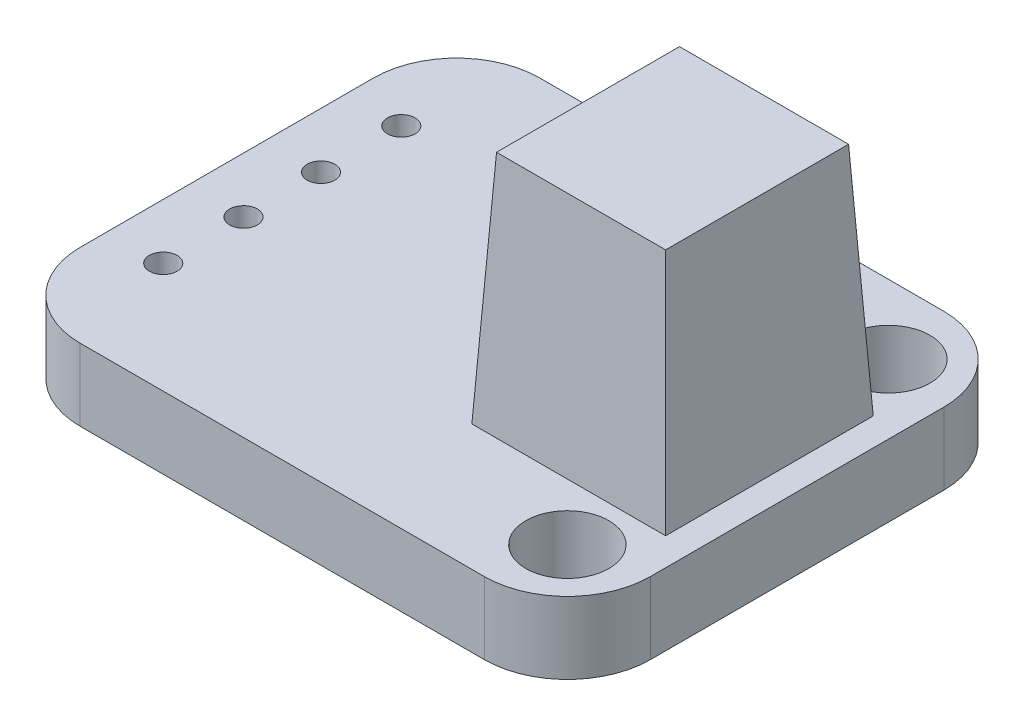
ISO-10303-21;
HEADER;
FILE_DESCRIPTION(('STEP AP214'),'2;1');
FILE_NAME('part.step','',(''),(''),'','','');
FILE_SCHEMA(('AUTOMOTIVE_DESIGN { 1 0 10303 214 1 1 1 1 }'));
ENDSEC;
DATA;
#1=APPLICATION_CONTEXT('core data for automotive mechanical design processes');
#2=APPLICATION_PROTOCOL_DEFINITION('international standard','automotive_design',2000,#1);
#3=PRODUCT_CONTEXT('',#1,'mechanical');
#4=PRODUCT('Part','Part','',(#3));
#5=PRODUCT_RELATED_PRODUCT_CATEGORY('part','',(#4));
#6=PRODUCT_DEFINITION_FORMATION('','',#4);
#7=PRODUCT_DEFINITION_CONTEXT('part definition',#1,'design');
#8=PRODUCT_DEFINITION('design','',#6,#7);
#9=PRODUCT_DEFINITION_SHAPE('','',#8);
#10=(LENGTH_UNIT() NAMED_UNIT(*) SI_UNIT(.MILLI.,.METRE.));
#11=(NAMED_UNIT(*) PLANE_ANGLE_UNIT() SI_UNIT($,.RADIAN.));
#12=(NAMED_UNIT(*) SI_UNIT($,.STERADIAN.) SOLID_ANGLE_UNIT());
#13=UNCERTAINTY_MEASURE_WITH_UNIT(LENGTH_MEASURE(1.E-05),#10,'distance_accuracy_value','');
#14=(GEOMETRIC_REPRESENTATION_CONTEXT(3) GLOBAL_UNCERTAINTY_ASSIGNED_CONTEXT((#13)) GLOBAL_UNIT_ASSIGNED_CONTEXT((#10,
#11,#12)) REPRESENTATION_CONTEXT('',''));
#15=CARTESIAN_POINT('',(0.,0.,0.));
#16=DIRECTION('',(0.,0.,1.));
#17=DIRECTION('',(1.,0.,0.));
#18=AXIS2_PLACEMENT_3D('',#15,#16,#17);
#19=CARTESIAN_POINT('',(0.,2.6,0.));
#20=DIRECTION('',(0.,-1.,0.));
#21=DIRECTION('',(0.,0.,-1.));
#22=AXIS2_PLACEMENT_3D('',#19,#20,#21);
#23=PLANE('',#22);
#24=CARTESIAN_POINT('',(-8.3,2.6,-4.3));
#25=DIRECTION('',(0.,1.,0.));
#26=DIRECTION('',(0.,0.,1.));
#27=AXIS2_PLACEMENT_3D('',#24,#25,#26);
#28=CIRCLE('',#27,0.500000000000001);
#29=CARTESIAN_POINT('',(-8.3,2.6,-3.8));
#30=VERTEX_POINT('',#29);
#31=EDGE_CURVE('E237',#30,#30,#28,.T.);
#32=ORIENTED_EDGE('',*,*,#31,.F.);
#33=EDGE_LOOP('',(#32));
#34=FACE_BOUND('',#33,.T.);
#35=CARTESIAN_POINT('',(-8.3,2.6,1.4));
#36=DIRECTION('',(0.,1.,0.));
#37=DIRECTION('',(0.,0.,1.));
#38=AXIS2_PLACEMENT_3D('',#35,#36,#37);
#39=CIRCLE('',#38,0.500000000000001);
#40=CARTESIAN_POINT('',(-8.3,2.6,1.9));
#41=VERTEX_POINT('',#40);
#42=EDGE_CURVE('E526',#41,#41,#39,.T.);
#43=ORIENTED_EDGE('',*,*,#42,.F.);
#44=EDGE_LOOP('',(#43));
#45=FACE_BOUND('',#44,.T.);
#46=CARTESIAN_POINT('',(-8.3,2.6,-1.4));
#47=DIRECTION('',(0.,1.,0.));
#48=DIRECTION('',(0.,0.,1.));
#49=AXIS2_PLACEMENT_3D('',#46,#47,#48);
#50=CIRCLE('',#49,0.500000000000001);
#51=CARTESIAN_POINT('',(-8.3,2.6,-0.9));
#52=VERTEX_POINT('',#51);
#53=EDGE_CURVE('E527',#52,#52,#50,.T.);
#54=ORIENTED_EDGE('',*,*,#53,.F.);
#55=EDGE_LOOP('',(#54));
#56=FACE_BOUND('',#55,.T.);
#57=CARTESIAN_POINT('',(-8.3,2.6,4.3));
#58=DIRECTION('',(0.,1.,0.));
#59=DIRECTION('',(0.,0.,1.));
#60=AXIS2_PLACEMENT_3D('',#57,#58,#59);
#61=CIRCLE('',#60,0.500000000000001);
#62=CARTESIAN_POINT('',(-8.3,2.6,4.8));
#63=VERTEX_POINT('',#62);
#64=EDGE_CURVE('E532',#63,#63,#61,.T.);
#65=ORIENTED_EDGE('',*,*,#64,.F.);
#66=EDGE_LOOP('',(#65));
#67=FACE_BOUND('',#66,.T.);
#68=DIRECTION('',(-1.,0.,0.));
#69=VECTOR('',#68,1.);
#70=CARTESIAN_POINT('',(-10.3,2.6,-8.3));
#71=LINE('',#70,#69);
#72=CARTESIAN_POINT('',(7.29999999999999,2.6,-8.3));
#73=VERTEX_POINT('',#72);
#74=CARTESIAN_POINT('',(-7.3,2.6,-8.3));
#75=VERTEX_POINT('',#74);
#76=EDGE_CURVE('E180',#73,#75,#71,.T.);
#77=ORIENTED_EDGE('',*,*,#76,.T.);
#78=CARTESIAN_POINT('',(-7.3,2.6,-5.3));
#79=DIRECTION('',(0.,-1.,0.));
#80=DIRECTION('',(0.,0.,-1.));
#81=AXIS2_PLACEMENT_3D('',#78,#79,#80);
#82=CIRCLE('',#81,3.);
#83=CARTESIAN_POINT('',(-10.3,2.6,-5.3));
#84=VERTEX_POINT('',#83);
#85=EDGE_CURVE('E224',#75,#84,#82,.F.);
#86=ORIENTED_EDGE('',*,*,#85,.T.);
#87=DIRECTION('',(0.,0.,1.));
#88=VECTOR('',#87,1.);
#89=CARTESIAN_POINT('',(-10.3,2.6,8.3));
#90=LINE('',#89,#88);
#91=CARTESIAN_POINT('',(-10.3,2.6,5.3));
#92=VERTEX_POINT('',#91);
#93=EDGE_CURVE('E184',#84,#92,#90,.T.);
#94=ORIENTED_EDGE('',*,*,#93,.T.);
#95=CARTESIAN_POINT('',(-7.3,2.6,5.3));
#96=DIRECTION('',(0.,-1.,0.));
#97=DIRECTION('',(0.,0.,-1.));
#98=AXIS2_PLACEMENT_3D('',#95,#96,#97);
#99=CIRCLE('',#98,3.);
#100=CARTESIAN_POINT('',(-7.3,2.6,8.3));
#101=VERTEX_POINT('',#100);
#102=EDGE_CURVE('E222',#92,#101,#99,.F.);
#103=ORIENTED_EDGE('',*,*,#102,.T.);
#104=DIRECTION('',(1.,0.,0.));
#105=VECTOR('',#104,1.);
#106=CARTESIAN_POINT('',(-10.3,2.6,8.3));
#107=LINE('',#106,#105);
#108=CARTESIAN_POINT('',(7.29999999999999,2.6,8.3));
#109=VERTEX_POINT('',#108);
#110=EDGE_CURVE('E187',#101,#109,#107,.T.);
#111=ORIENTED_EDGE('',*,*,#110,.T.);
#112=CARTESIAN_POINT('',(7.3,2.6,5.3));
#113=DIRECTION('',(0.,-1.,0.));
#114=DIRECTION('',(0.,0.,-1.));
#115=AXIS2_PLACEMENT_3D('',#112,#113,#114);
#116=CIRCLE('',#115,3.);
#117=CARTESIAN_POINT('',(10.3,2.6,5.3));
#118=VERTEX_POINT('',#117);
#119=EDGE_CURVE('E218',#109,#118,#116,.F.);
#120=ORIENTED_EDGE('',*,*,#119,.T.);
#121=DIRECTION('',(0.,0.,-1.));
#122=VECTOR('',#121,1.);
#123=CARTESIAN_POINT('',(10.3,2.6,8.3));
#124=LINE('',#123,#122);
#125=CARTESIAN_POINT('',(10.3,2.6,-5.3));
#126=VERTEX_POINT('',#125);
#127=EDGE_CURVE('E177',#118,#126,#124,.T.);
#128=ORIENTED_EDGE('',*,*,#127,.T.);
#129=CARTESIAN_POINT('',(7.3,2.6,-5.3));
#130=DIRECTION('',(0.,-1.,0.));
#131=DIRECTION('',(0.,0.,-1.));
#132=AXIS2_PLACEMENT_3D('',#129,#130,#131);
#133=CIRCLE('',#132,3.);
#134=EDGE_CURVE('E220',#126,#73,#133,.F.);
#135=ORIENTED_EDGE('',*,*,#134,.T.);
#136=EDGE_LOOP('',(#77,#86,#94,#103,#111,#120,#128,#135));
#137=FACE_BOUND('',#136,.T.);
#138=CARTESIAN_POINT('',(7.8,2.6,5.8));
#139=DIRECTION('',(0.,1.,0.));
#140=DIRECTION('',(0.,0.,1.));
#141=AXIS2_PLACEMENT_3D('',#138,#139,#140);
#142=CIRCLE('',#141,1.5);
#143=CARTESIAN_POINT('',(7.8,2.6,7.3));
#144=VERTEX_POINT('',#143);
#145=EDGE_CURVE('E174',#144,#144,#142,.T.);
#146=ORIENTED_EDGE('',*,*,#145,.F.);
#147=EDGE_LOOP('',(#146));
#148=FACE_BOUND('',#147,.T.);
#149=CARTESIAN_POINT('',(7.8,2.6,-5.8));
#150=DIRECTION('',(0.,1.,0.));
#151=DIRECTION('',(0.,0.,1.));
#152=AXIS2_PLACEMENT_3D('',#149,#150,#151);
#153=CIRCLE('',#152,1.5);
#154=CARTESIAN_POINT('',(7.8,2.6,-4.3));
#155=VERTEX_POINT('',#154);
#156=EDGE_CURVE('E168',#155,#155,#153,.T.);
#157=ORIENTED_EDGE('',*,*,#156,.F.);
#158=EDGE_LOOP('',(#157));
#159=FACE_BOUND('',#158,.T.);
#160=DIRECTION('',(0.,0.,-1.));
#161=VECTOR('',#160,1.);
#162=CARTESIAN_POINT('',(9.3,2.6,-3.75));
#163=LINE('',#162,#161);
#164=CARTESIAN_POINT('',(9.3,2.6,3.75));
#165=VERTEX_POINT('',#164);
#166=CARTESIAN_POINT('',(9.3,2.6,-3.75));
#167=VERTEX_POINT('',#166);
#168=EDGE_CURVE('E129',#165,#167,#163,.T.);
#169=ORIENTED_EDGE('',*,*,#168,.F.);
#170=DIRECTION('',(1.,0.,0.));
#171=VECTOR('',#170,1.);
#172=CARTESIAN_POINT('',(2.3,2.6,3.75));
#173=LINE('',#172,#171);
#174=CARTESIAN_POINT('',(2.3,2.6,3.75));
#175=VERTEX_POINT('',#174);
#176=EDGE_CURVE('E131',#175,#165,#173,.T.);
#177=ORIENTED_EDGE('',*,*,#176,.F.);
#178=DIRECTION('',(0.,0.,1.));
#179=VECTOR('',#178,1.);
#180=CARTESIAN_POINT('',(2.3,2.6,-3.75));
#181=LINE('',#180,#179);
#182=CARTESIAN_POINT('',(2.3,2.6,-3.75));
#183=VERTEX_POINT('',#182);
#184=EDGE_CURVE('E65',#183,#175,#181,.T.);
#185=ORIENTED_EDGE('',*,*,#184,.F.);
#186=DIRECTION('',(-1.,0.,0.));
#187=VECTOR('',#186,1.);
#188=CARTESIAN_POINT('',(2.3,2.6,-3.75));
#189=LINE('',#188,#187);
#190=EDGE_CURVE('E60',#167,#183,#189,.T.);
#191=ORIENTED_EDGE('',*,*,#190,.F.);
#192=EDGE_LOOP('',(#169,#177,#185,#191));
#193=FACE_BOUND('',#192,.T.);
#194=ADVANCED_FACE('F43',(#34,#45,#56,#67,#137,#148,#159,#193),#23,.F.);
#195=CARTESIAN_POINT('',(10.3,2.6,8.3));
#196=DIRECTION('',(-1.,0.,0.));
#197=DIRECTION('',(0.,0.,1.));
#198=AXIS2_PLACEMENT_3D('',#195,#196,#197);
#199=PLANE('',#198);
#200=DIRECTION('',(0.,0.,-1.));
#201=VECTOR('',#200,1.);
#202=CARTESIAN_POINT('',(10.3,0.,8.3));
#203=LINE('',#202,#201);
#204=CARTESIAN_POINT('',(10.3,0.,5.3));
#205=VERTEX_POINT('',#204);
#206=CARTESIAN_POINT('',(10.3,0.,-5.3));
#207=VERTEX_POINT('',#206);
#208=EDGE_CURVE('E167',#205,#207,#203,.T.);
#209=ORIENTED_EDGE('',*,*,#208,.T.);
#210=DIRECTION('',(0.,-1.,0.));
#211=VECTOR('',#210,1.);
#212=CARTESIAN_POINT('',(10.3,2.6,-5.3));
#213=LINE('',#212,#211);
#214=EDGE_CURVE('E11',#207,#126,#213,.F.);
#215=ORIENTED_EDGE('',*,*,#214,.T.);
#216=ORIENTED_EDGE('',*,*,#127,.F.);
#217=DIRECTION('',(0.,-1.,0.));
#218=VECTOR('',#217,1.);
#219=CARTESIAN_POINT('',(10.3,2.6,5.3));
#220=LINE('',#219,#218);
#221=EDGE_CURVE('E52',#118,#205,#220,.T.);
#222=ORIENTED_EDGE('',*,*,#221,.T.);
#223=EDGE_LOOP('',(#209,#215,#216,#222));
#224=FACE_BOUND('',#223,.T.);
#225=ADVANCED_FACE('F287',(#224),#199,.F.);
#226=CARTESIAN_POINT('',(-10.3,2.6,-8.3));
#227=DIRECTION('',(0.,0.,1.));
#228=DIRECTION('',(1.,0.,0.));
#229=AXIS2_PLACEMENT_3D('',#226,#227,#228);
#230=PLANE('',#229);
#231=DIRECTION('',(-1.,0.,0.));
#232=VECTOR('',#231,1.);
#233=CARTESIAN_POINT('',(-10.3,0.,-8.3));
#234=LINE('',#233,#232);
#235=CARTESIAN_POINT('',(7.29999999999999,0.,-8.3));
#236=VERTEX_POINT('',#235);
#237=CARTESIAN_POINT('',(-7.3,0.,-8.3));
#238=VERTEX_POINT('',#237);
#239=EDGE_CURVE('E193',#236,#238,#234,.T.);
#240=ORIENTED_EDGE('',*,*,#239,.T.);
#241=DIRECTION('',(0.,-1.,0.));
#242=VECTOR('',#241,1.);
#243=CARTESIAN_POINT('',(-7.3,2.6,-8.3));
#244=LINE('',#243,#242);
#245=EDGE_CURVE('E216',#238,#75,#244,.F.);
#246=ORIENTED_EDGE('',*,*,#245,.T.);
#247=ORIENTED_EDGE('',*,*,#76,.F.);
#248=DIRECTION('',(0.,-1.,0.));
#249=VECTOR('',#248,1.);
#250=CARTESIAN_POINT('',(7.3,2.6,-8.3));
#251=LINE('',#250,#249);
#252=EDGE_CURVE('E213',#73,#236,#251,.T.);
#253=ORIENTED_EDGE('',*,*,#252,.T.);
#254=EDGE_LOOP('',(#240,#246,#247,#253));
#255=FACE_BOUND('',#254,.T.);
#256=ADVANCED_FACE('F296',(#255),#230,.F.);
#257=CARTESIAN_POINT('',(-10.3,2.6,8.3));
#258=DIRECTION('',(1.,0.,0.));
#259=DIRECTION('',(0.,0.,-1.));
#260=AXIS2_PLACEMENT_3D('',#257,#258,#259);
#261=PLANE('',#260);
#262=ORIENTED_EDGE('',*,*,#93,.F.);
#263=DIRECTION('',(0.,-1.,0.));
#264=VECTOR('',#263,1.);
#265=CARTESIAN_POINT('',(-10.3,2.6,-5.3));
#266=LINE('',#265,#264);
#267=CARTESIAN_POINT('',(-10.3,0.,-5.3));
#268=VERTEX_POINT('',#267);
#269=EDGE_CURVE('E202',#84,#268,#266,.T.);
#270=ORIENTED_EDGE('',*,*,#269,.T.);
#271=DIRECTION('',(0.,0.,1.));
#272=VECTOR('',#271,1.);
#273=CARTESIAN_POINT('',(-10.3,0.,8.3));
#274=LINE('',#273,#272);
#275=CARTESIAN_POINT('',(-10.3,0.,5.3));
#276=VERTEX_POINT('',#275);
#277=EDGE_CURVE('E196',#268,#276,#274,.T.);
#278=ORIENTED_EDGE('',*,*,#277,.T.);
#279=DIRECTION('',(0.,-1.,0.));
#280=VECTOR('',#279,1.);
#281=CARTESIAN_POINT('',(-10.3,2.6,5.3));
#282=LINE('',#281,#280);
#283=EDGE_CURVE('E190',#276,#92,#282,.F.);
#284=ORIENTED_EDGE('',*,*,#283,.T.);
#285=EDGE_LOOP('',(#262,#270,#278,#284));
#286=FACE_BOUND('',#285,.T.);
#287=ADVANCED_FACE('F270',(#286),#261,.F.);
#288=CARTESIAN_POINT('',(-10.3,2.6,8.3));
#289=DIRECTION('',(0.,0.,-1.));
#290=DIRECTION('',(-1.,0.,0.));
#291=AXIS2_PLACEMENT_3D('',#288,#289,#290);
#292=PLANE('',#291);
#293=ORIENTED_EDGE('',*,*,#110,.F.);
#294=DIRECTION('',(0.,-1.,0.));
#295=VECTOR('',#294,1.);
#296=CARTESIAN_POINT('',(-7.3,2.6,8.3));
#297=LINE('',#296,#295);
#298=CARTESIAN_POINT('',(-7.3,0.,8.3));
#299=VERTEX_POINT('',#298);
#300=EDGE_CURVE('E228',#101,#299,#297,.T.);
#301=ORIENTED_EDGE('',*,*,#300,.T.);
#302=DIRECTION('',(1.,0.,0.));
#303=VECTOR('',#302,1.);
#304=CARTESIAN_POINT('',(-10.3,0.,8.3));
#305=LINE('',#304,#303);
#306=CARTESIAN_POINT('',(7.29999999999999,0.,8.3));
#307=VERTEX_POINT('',#306);
#308=EDGE_CURVE('E181',#299,#307,#305,.T.);
#309=ORIENTED_EDGE('',*,*,#308,.T.);
#310=DIRECTION('',(0.,-1.,0.));
#311=VECTOR('',#310,1.);
#312=CARTESIAN_POINT('',(7.3,2.6,8.3));
#313=LINE('',#312,#311);
#314=EDGE_CURVE('E226',#307,#109,#313,.F.);
#315=ORIENTED_EDGE('',*,*,#314,.T.);
#316=EDGE_LOOP('',(#293,#301,#309,#315));
#317=FACE_BOUND('',#316,.T.);
#318=ADVANCED_FACE('F253',(#317),#292,.F.);
#319=CARTESIAN_POINT('',(0.,0.,0.));
#320=DIRECTION('',(0.,-1.,0.));
#321=DIRECTION('',(0.,0.,-1.));
#322=AXIS2_PLACEMENT_3D('',#319,#320,#321);
#323=PLANE('',#322);
#324=CARTESIAN_POINT('',(-8.3,0.,-4.3));
#325=DIRECTION('',(0.,-1.,0.));
#326=DIRECTION('',(0.,0.,-1.));
#327=AXIS2_PLACEMENT_3D('',#324,#325,#326);
#328=CIRCLE('',#327,0.500000000000001);
#329=CARTESIAN_POINT('',(-8.3,0.,-4.8));
#330=VERTEX_POINT('',#329);
#331=EDGE_CURVE('E47',#330,#330,#328,.T.);
#332=ORIENTED_EDGE('',*,*,#331,.F.);
#333=EDGE_LOOP('',(#332));
#334=FACE_BOUND('',#333,.T.);
#335=CARTESIAN_POINT('',(-8.3,0.,1.4));
#336=DIRECTION('',(0.,-1.,0.));
#337=DIRECTION('',(0.,0.,-1.));
#338=AXIS2_PLACEMENT_3D('',#335,#336,#337);
#339=CIRCLE('',#338,0.500000000000001);
#340=CARTESIAN_POINT('',(-8.3,0.,0.899999999999999));
#341=VERTEX_POINT('',#340);
#342=EDGE_CURVE('E239',#341,#341,#339,.T.);
#343=ORIENTED_EDGE('',*,*,#342,.F.);
#344=EDGE_LOOP('',(#343));
#345=FACE_BOUND('',#344,.T.);
#346=CARTESIAN_POINT('',(-8.3,0.,-1.4));
#347=DIRECTION('',(0.,-1.,0.));
#348=DIRECTION('',(0.,0.,-1.));
#349=AXIS2_PLACEMENT_3D('',#346,#347,#348);
#350=CIRCLE('',#349,0.500000000000001);
#351=CARTESIAN_POINT('',(-8.3,0.,-1.9));
#352=VERTEX_POINT('',#351);
#353=EDGE_CURVE('E236',#352,#352,#350,.T.);
#354=ORIENTED_EDGE('',*,*,#353,.F.);
#355=EDGE_LOOP('',(#354));
#356=FACE_BOUND('',#355,.T.);
#357=CARTESIAN_POINT('',(-8.3,0.,4.3));
#358=DIRECTION('',(0.,-1.,0.));
#359=DIRECTION('',(0.,0.,-1.));
#360=AXIS2_PLACEMENT_3D('',#357,#358,#359);
#361=CIRCLE('',#360,0.500000000000001);
#362=CARTESIAN_POINT('',(-8.3,0.,3.8));
#363=VERTEX_POINT('',#362);
#364=EDGE_CURVE('E233',#363,#363,#361,.T.);
#365=ORIENTED_EDGE('',*,*,#364,.F.);
#366=EDGE_LOOP('',(#365));
#367=FACE_BOUND('',#366,.T.);
#368=CARTESIAN_POINT('',(7.8,0.,-5.8));
#369=DIRECTION('',(0.,1.,0.));
#370=DIRECTION('',(0.,0.,1.));
#371=AXIS2_PLACEMENT_3D('',#368,#369,#370);
#372=CIRCLE('',#371,1.5);
#373=CARTESIAN_POINT('',(7.8,0.,-4.3));
#374=VERTEX_POINT('',#373);
#375=EDGE_CURVE('E164',#374,#374,#372,.T.);
#376=ORIENTED_EDGE('',*,*,#375,.T.);
#377=EDGE_LOOP('',(#376));
#378=FACE_BOUND('',#377,.T.);
#379=CARTESIAN_POINT('',(7.8,0.,5.8));
#380=DIRECTION('',(0.,1.,0.));
#381=DIRECTION('',(0.,0.,1.));
#382=AXIS2_PLACEMENT_3D('',#379,#380,#381);
#383=CIRCLE('',#382,1.5);
#384=CARTESIAN_POINT('',(7.8,0.,7.3));
#385=VERTEX_POINT('',#384);
#386=EDGE_CURVE('E171',#385,#385,#383,.T.);
#387=ORIENTED_EDGE('',*,*,#386,.T.);
#388=EDGE_LOOP('',(#387));
#389=FACE_BOUND('',#388,.T.);
#390=ORIENTED_EDGE('',*,*,#277,.F.);
#391=CARTESIAN_POINT('',(-7.3,0.,-5.3));
#392=DIRECTION('',(0.,-1.,0.));
#393=DIRECTION('',(0.,0.,-1.));
#394=AXIS2_PLACEMENT_3D('',#391,#392,#393);
#395=CIRCLE('',#394,3.);
#396=EDGE_CURVE('E211',#268,#238,#395,.T.);
#397=ORIENTED_EDGE('',*,*,#396,.T.);
#398=ORIENTED_EDGE('',*,*,#239,.F.);
#399=CARTESIAN_POINT('',(7.3,0.,-5.3));
#400=DIRECTION('',(0.,-1.,0.));
#401=DIRECTION('',(0.,0.,-1.));
#402=AXIS2_PLACEMENT_3D('',#399,#400,#401);
#403=CIRCLE('',#402,3.);
#404=EDGE_CURVE('E207',#236,#207,#403,.T.);
#405=ORIENTED_EDGE('',*,*,#404,.T.);
#406=ORIENTED_EDGE('',*,*,#208,.F.);
#407=CARTESIAN_POINT('',(7.3,0.,5.3));
#408=DIRECTION('',(0.,-1.,0.));
#409=DIRECTION('',(0.,0.,-1.));
#410=AXIS2_PLACEMENT_3D('',#407,#408,#409);
#411=CIRCLE('',#410,3.);
#412=EDGE_CURVE('E205',#205,#307,#411,.T.);
#413=ORIENTED_EDGE('',*,*,#412,.T.);
#414=ORIENTED_EDGE('',*,*,#308,.F.);
#415=CARTESIAN_POINT('',(-7.3,0.,5.3));
#416=DIRECTION('',(0.,-1.,0.));
#417=DIRECTION('',(0.,0.,-1.));
#418=AXIS2_PLACEMENT_3D('',#415,#416,#417);
#419=CIRCLE('',#418,3.);
#420=EDGE_CURVE('E209',#299,#276,#419,.T.);
#421=ORIENTED_EDGE('',*,*,#420,.T.);
#422=EDGE_LOOP('',(#390,#397,#398,#405,#406,#413,#414,#421));
#423=FACE_BOUND('',#422,.T.);
#424=ADVANCED_FACE('F249',(#334,#345,#356,#367,#378,#389,#423),#323,.T.);
#425=CARTESIAN_POINT('',(-7.3,2.6,-5.3));
#426=DIRECTION('',(0.,-1.,0.));
#427=DIRECTION('',(0.,0.,-1.));
#428=AXIS2_PLACEMENT_3D('',#425,#426,#427);
#429=CYLINDRICAL_SURFACE('',#428,3.);
#430=ORIENTED_EDGE('',*,*,#85,.F.);
#431=ORIENTED_EDGE('',*,*,#245,.F.);
#432=ORIENTED_EDGE('',*,*,#396,.F.);
#433=ORIENTED_EDGE('',*,*,#269,.F.);
#434=EDGE_LOOP('',(#430,#431,#432,#433));
#435=FACE_BOUND('',#434,.T.);
#436=ADVANCED_FACE('F252',(#435),#429,.T.);
#437=CARTESIAN_POINT('',(-7.3,2.6,5.3));
#438=DIRECTION('',(0.,-1.,0.));
#439=DIRECTION('',(0.,0.,-1.));
#440=AXIS2_PLACEMENT_3D('',#437,#438,#439);
#441=CYLINDRICAL_SURFACE('',#440,3.);
#442=ORIENTED_EDGE('',*,*,#102,.F.);
#443=ORIENTED_EDGE('',*,*,#283,.F.);
#444=ORIENTED_EDGE('',*,*,#420,.F.);
#445=ORIENTED_EDGE('',*,*,#300,.F.);
#446=EDGE_LOOP('',(#442,#443,#444,#445));
#447=FACE_BOUND('',#446,.T.);
#448=ADVANCED_FACE('F274',(#447),#441,.T.);
#449=CARTESIAN_POINT('',(7.3,2.6,-5.3));
#450=DIRECTION('',(0.,-1.,0.));
#451=DIRECTION('',(0.,0.,-1.));
#452=AXIS2_PLACEMENT_3D('',#449,#450,#451);
#453=CYLINDRICAL_SURFACE('',#452,3.);
#454=ORIENTED_EDGE('',*,*,#134,.F.);
#455=ORIENTED_EDGE('',*,*,#214,.F.);
#456=ORIENTED_EDGE('',*,*,#404,.F.);
#457=ORIENTED_EDGE('',*,*,#252,.F.);
#458=EDGE_LOOP('',(#454,#455,#456,#457));
#459=FACE_BOUND('',#458,.T.);
#460=ADVANCED_FACE('F291',(#459),#453,.T.);
#461=CARTESIAN_POINT('',(7.3,2.6,5.3));
#462=DIRECTION('',(0.,-1.,0.));
#463=DIRECTION('',(0.,0.,-1.));
#464=AXIS2_PLACEMENT_3D('',#461,#462,#463);
#465=CYLINDRICAL_SURFACE('',#464,3.);
#466=ORIENTED_EDGE('',*,*,#119,.F.);
#467=ORIENTED_EDGE('',*,*,#314,.F.);
#468=ORIENTED_EDGE('',*,*,#412,.F.);
#469=ORIENTED_EDGE('',*,*,#221,.F.);
#470=EDGE_LOOP('',(#466,#467,#468,#469));
#471=FACE_BOUND('',#470,.T.);
#472=ADVANCED_FACE('F45',(#471),#465,.T.);
#473=CARTESIAN_POINT('',(7.8,0.,5.8));
#474=DIRECTION('',(0.,1.,0.));
#475=DIRECTION('',(0.,0.,1.));
#476=AXIS2_PLACEMENT_3D('',#473,#474,#475);
#477=CYLINDRICAL_SURFACE('',#476,1.5);
#478=ORIENTED_EDGE('',*,*,#386,.F.);
#479=EDGE_LOOP('',(#478));
#480=FACE_BOUND('',#479,.T.);
#481=ORIENTED_EDGE('',*,*,#145,.T.);
#482=EDGE_LOOP('',(#481));
#483=FACE_BOUND('',#482,.T.);
#484=ADVANCED_FACE('F315',(#480,#483),#477,.F.);
#485=CARTESIAN_POINT('',(7.8,0.,-5.8));
#486=DIRECTION('',(0.,1.,0.));
#487=DIRECTION('',(0.,0.,1.));
#488=AXIS2_PLACEMENT_3D('',#485,#486,#487);
#489=CYLINDRICAL_SURFACE('',#488,1.5);
#490=ORIENTED_EDGE('',*,*,#375,.F.);
#491=EDGE_LOOP('',(#490));
#492=FACE_BOUND('',#491,.T.);
#493=ORIENTED_EDGE('',*,*,#156,.T.);
#494=EDGE_LOOP('',(#493));
#495=FACE_BOUND('',#494,.T.);
#496=ADVANCED_FACE('F374',(#492,#495),#489,.F.);
#497=CARTESIAN_POINT('',(9.3,2.6,-3.75));
#498=DIRECTION('',(0.998629534754574,0.0523359562429439,0.));
#499=DIRECTION('',(-0.0523359562429439,0.998629534754574,0.));
#500=AXIS2_PLACEMENT_3D('',#497,#498,#499);
#501=PLANE('',#500);
#502=ORIENTED_EDGE('',*,*,#168,.T.);
#503=DIRECTION('',(0.052264427688714,-0.997264688634237,-0.052264427688714));
#504=VECTOR('',#503,1.);
#505=CARTESIAN_POINT('',(9.2808790071886,2.96485027743942,-3.7308790071886));
#506=LINE('',#505,#504);
#507=CARTESIAN_POINT('',(8.85453387609415,11.1,-3.30453387609415));
#508=VERTEX_POINT('',#507);
#509=EDGE_CURVE('E156',#508,#167,#506,.T.);
#510=ORIENTED_EDGE('',*,*,#509,.F.);
#511=DIRECTION('',(0.,0.,1.));
#512=VECTOR('',#511,1.);
#513=CARTESIAN_POINT('',(8.85453387609415,11.1,-3.75));
#514=LINE('',#513,#512);
#515=CARTESIAN_POINT('',(8.85453387609415,11.1,3.30453387609415));
#516=VERTEX_POINT('',#515);
#517=EDGE_CURVE('E145',#516,#508,#514,.F.);
#518=ORIENTED_EDGE('',*,*,#517,.F.);
#519=DIRECTION('',(0.052264427688714,-0.997264688634237,0.052264427688714));
#520=VECTOR('',#519,1.);
#521=CARTESIAN_POINT('',(9.27951322198778,2.99091101154224,3.72951322198778));
#522=LINE('',#521,#520);
#523=EDGE_CURVE('E141',#516,#165,#522,.T.);
#524=ORIENTED_EDGE('',*,*,#523,.T.);
#525=EDGE_LOOP('',(#502,#510,#518,#524));
#526=FACE_BOUND('',#525,.T.);
#527=ADVANCED_FACE('F147',(#526),#501,.T.);
#528=CARTESIAN_POINT('',(2.3,2.6,-3.75));
#529=DIRECTION('',(0.,0.0523359562429439,-0.998629534754574));
#530=DIRECTION('',(0.,0.998629534754574,0.0523359562429439));
#531=AXIS2_PLACEMENT_3D('',#528,#529,#530);
#532=PLANE('',#531);
#533=ORIENTED_EDGE('',*,*,#190,.T.);
#534=DIRECTION('',(-0.052264427688714,-0.997264688634237,-0.052264427688714));
#535=VECTOR('',#534,1.);
#536=CARTESIAN_POINT('',(2.3,2.6,-3.75));
#537=LINE('',#536,#535);
#538=CARTESIAN_POINT('',(2.74546612390585,11.1,-3.30453387609415));
#539=VERTEX_POINT('',#538);
#540=EDGE_CURVE('E151',#539,#183,#537,.T.);
#541=ORIENTED_EDGE('',*,*,#540,.F.);
#542=DIRECTION('',(1.,0.,0.));
#543=VECTOR('',#542,1.);
#544=CARTESIAN_POINT('',(2.3,11.1,-3.30453387609415));
#545=LINE('',#544,#543);
#546=EDGE_CURVE('E161',#508,#539,#545,.F.);
#547=ORIENTED_EDGE('',*,*,#546,.F.);
#548=ORIENTED_EDGE('',*,*,#509,.T.);
#549=EDGE_LOOP('',(#533,#541,#547,#548));
#550=FACE_BOUND('',#549,.T.);
#551=ADVANCED_FACE('F391',(#550),#532,.T.);
#552=CARTESIAN_POINT('',(2.3,2.6,-3.75));
#553=DIRECTION('',(-0.998629534754574,0.0523359562429439,0.));
#554=DIRECTION('',(-0.0523359562429439,-0.998629534754574,0.));
#555=AXIS2_PLACEMENT_3D('',#552,#553,#554);
#556=PLANE('',#555);
#557=ORIENTED_EDGE('',*,*,#184,.T.);
#558=DIRECTION('',(-0.052264427688714,-0.997264688634237,0.052264427688714));
#559=VECTOR('',#558,1.);
#560=CARTESIAN_POINT('',(2.3,2.6,3.75));
#561=LINE('',#560,#559);
#562=CARTESIAN_POINT('',(2.74546612390585,11.1,3.30453387609415));
#563=VERTEX_POINT('',#562);
#564=EDGE_CURVE('E144',#563,#175,#561,.T.);
#565=ORIENTED_EDGE('',*,*,#564,.F.);
#566=DIRECTION('',(0.,0.,-1.));
#567=VECTOR('',#566,1.);
#568=CARTESIAN_POINT('',(2.74546612390585,11.1,-3.75));
#569=LINE('',#568,#567);
#570=EDGE_CURVE('E153',#539,#563,#569,.F.);
#571=ORIENTED_EDGE('',*,*,#570,.F.);
#572=ORIENTED_EDGE('',*,*,#540,.T.);
#573=EDGE_LOOP('',(#557,#565,#571,#572));
#574=FACE_BOUND('',#573,.T.);
#575=ADVANCED_FACE('F400',(#574),#556,.T.);
#576=CARTESIAN_POINT('',(2.3,2.6,3.75));
#577=DIRECTION('',(0.,0.0523359562429439,0.998629534754574));
#578=DIRECTION('',(0.,-0.998629534754574,0.0523359562429439));
#579=AXIS2_PLACEMENT_3D('',#576,#577,#578);
#580=PLANE('',#579);
#581=ORIENTED_EDGE('',*,*,#176,.T.);
#582=ORIENTED_EDGE('',*,*,#523,.F.);
#583=DIRECTION('',(-1.,0.,0.));
#584=VECTOR('',#583,1.);
#585=CARTESIAN_POINT('',(2.3,11.1,3.30453387609415));
#586=LINE('',#585,#584);
#587=EDGE_CURVE('E149',#563,#516,#586,.F.);
#588=ORIENTED_EDGE('',*,*,#587,.F.);
#589=ORIENTED_EDGE('',*,*,#564,.T.);
#590=EDGE_LOOP('',(#581,#582,#588,#589));
#591=FACE_BOUND('',#590,.T.);
#592=ADVANCED_FACE('F139',(#591),#580,.T.);
#593=CARTESIAN_POINT('',(0.,11.1,0.));
#594=DIRECTION('',(0.,1.,0.));
#595=DIRECTION('',(0.,0.,1.));
#596=AXIS2_PLACEMENT_3D('',#593,#594,#595);
#597=PLANE('',#596);
#598=ORIENTED_EDGE('',*,*,#517,.T.);
#599=ORIENTED_EDGE('',*,*,#546,.T.);
#600=ORIENTED_EDGE('',*,*,#570,.T.);
#601=ORIENTED_EDGE('',*,*,#587,.T.);
#602=EDGE_LOOP('',(#598,#599,#600,#601));
#603=FACE_BOUND('',#602,.T.);
#604=ADVANCED_FACE('F419',(#603),#597,.T.);
#605=CARTESIAN_POINT('',(-8.3,-5.9,4.3));
#606=DIRECTION('',(0.,1.,0.));
#607=DIRECTION('',(0.,0.,1.));
#608=AXIS2_PLACEMENT_3D('',#605,#606,#607);
#609=CYLINDRICAL_SURFACE('',#608,0.500000000000001);
#610=ORIENTED_EDGE('',*,*,#364,.T.);
#611=EDGE_LOOP('',(#610));
#612=FACE_BOUND('',#611,.T.);
#613=ORIENTED_EDGE('',*,*,#64,.T.);
#614=EDGE_LOOP('',(#613));
#615=FACE_BOUND('',#614,.T.);
#616=ADVANCED_FACE('F428',(#612,#615),#609,.F.);
#617=CARTESIAN_POINT('',(-8.3,-5.9,-1.4));
#618=DIRECTION('',(0.,1.,0.));
#619=DIRECTION('',(0.,0.,1.));
#620=AXIS2_PLACEMENT_3D('',#617,#618,#619);
#621=CYLINDRICAL_SURFACE('',#620,0.500000000000001);
#622=ORIENTED_EDGE('',*,*,#353,.T.);
#623=EDGE_LOOP('',(#622));
#624=FACE_BOUND('',#623,.T.);
#625=ORIENTED_EDGE('',*,*,#53,.T.);
#626=EDGE_LOOP('',(#625));
#627=FACE_BOUND('',#626,.T.);
#628=ADVANCED_FACE('F437',(#624,#627),#621,.F.);
#629=CARTESIAN_POINT('',(-8.3,-5.9,1.4));
#630=DIRECTION('',(0.,1.,0.));
#631=DIRECTION('',(0.,0.,1.));
#632=AXIS2_PLACEMENT_3D('',#629,#630,#631);
#633=CYLINDRICAL_SURFACE('',#632,0.500000000000001);
#634=ORIENTED_EDGE('',*,*,#342,.T.);
#635=EDGE_LOOP('',(#634));
#636=FACE_BOUND('',#635,.T.);
#637=ORIENTED_EDGE('',*,*,#42,.T.);
#638=EDGE_LOOP('',(#637));
#639=FACE_BOUND('',#638,.T.);
#640=ADVANCED_FACE('F447',(#636,#639),#633,.F.);
#641=CARTESIAN_POINT('',(-8.3,-5.9,-4.3));
#642=DIRECTION('',(0.,1.,0.));
#643=DIRECTION('',(0.,0.,1.));
#644=AXIS2_PLACEMENT_3D('',#641,#642,#643);
#645=CYLINDRICAL_SURFACE('',#644,0.500000000000001);
#646=ORIENTED_EDGE('',*,*,#331,.T.);
#647=EDGE_LOOP('',(#646));
#648=FACE_BOUND('',#647,.T.);
#649=ORIENTED_EDGE('',*,*,#31,.T.);
#650=EDGE_LOOP('',(#649));
#651=FACE_BOUND('',#650,.T.);
#652=ADVANCED_FACE('F246',(#648,#651),#645,.F.);
#653=CLOSED_SHELL('',(#194,#225,#256,#287,#318,#424,#436,#448,#460,#472,#484,#496,#527,#551,
#575,#592,#604,#616,#628,#640,#652));
#654=MANIFOLD_SOLID_BREP('B2',#653);
#655=ADVANCED_BREP_SHAPE_REPRESENTATION('',(#18,#654),#14);
#656=SHAPE_DEFINITION_REPRESENTATION(#9,#655);
ENDSEC;
END-ISO-10303-21;
